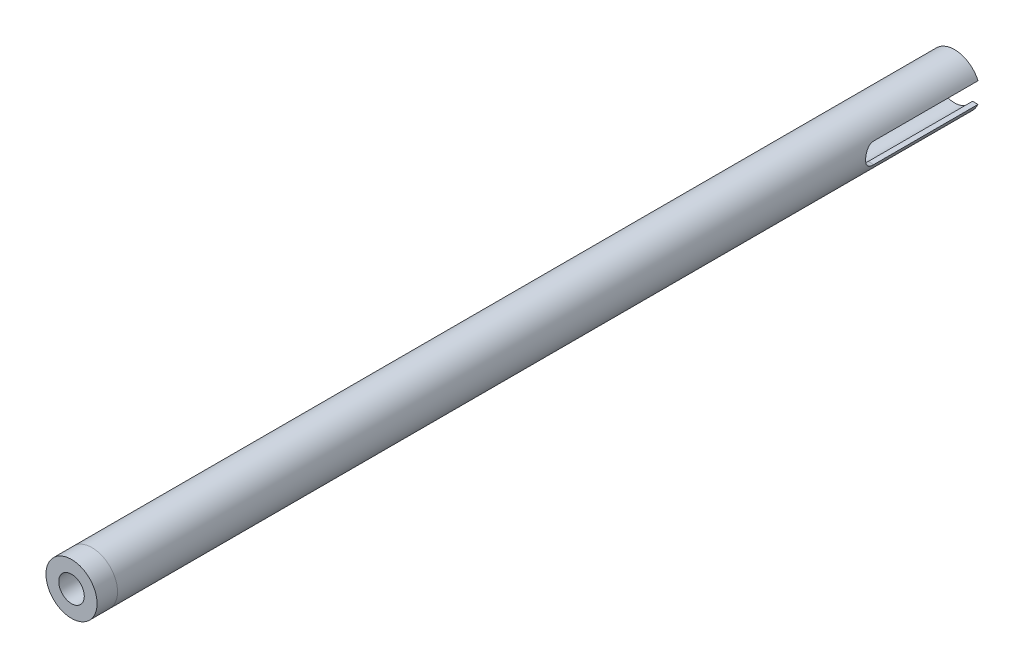
ISO-10303-21;
HEADER;
FILE_DESCRIPTION(('STEP AP214'),'2;1');
FILE_NAME('part.step','',(''),(''),'','','');
FILE_SCHEMA(('AUTOMOTIVE_DESIGN { 1 0 10303 214 1 1 1 1 }'));
ENDSEC;
DATA;
#1=APPLICATION_CONTEXT('core data for automotive mechanical design processes');
#2=APPLICATION_PROTOCOL_DEFINITION('international standard','automotive_design',2000,#1);
#3=PRODUCT_CONTEXT('',#1,'mechanical');
#4=PRODUCT('Part','Part','',(#3));
#5=PRODUCT_RELATED_PRODUCT_CATEGORY('part','',(#4));
#6=PRODUCT_DEFINITION_FORMATION('','',#4);
#7=PRODUCT_DEFINITION_CONTEXT('part definition',#1,'design');
#8=PRODUCT_DEFINITION('design','',#6,#7);
#9=PRODUCT_DEFINITION_SHAPE('','',#8);
#10=(LENGTH_UNIT() NAMED_UNIT(*) SI_UNIT(.MILLI.,.METRE.));
#11=(NAMED_UNIT(*) PLANE_ANGLE_UNIT() SI_UNIT($,.RADIAN.));
#12=(NAMED_UNIT(*) SI_UNIT($,.STERADIAN.) SOLID_ANGLE_UNIT());
#13=UNCERTAINTY_MEASURE_WITH_UNIT(LENGTH_MEASURE(1.E-05),#10,'distance_accuracy_value','');
#14=(GEOMETRIC_REPRESENTATION_CONTEXT(3) GLOBAL_UNCERTAINTY_ASSIGNED_CONTEXT((#13)) GLOBAL_UNIT_ASSIGNED_CONTEXT((#10,
#11,#12)) REPRESENTATION_CONTEXT('',''));
#15=CARTESIAN_POINT('',(0.,0.,0.));
#16=DIRECTION('',(0.,0.,1.));
#17=DIRECTION('',(1.,0.,0.));
#18=AXIS2_PLACEMENT_3D('',#15,#16,#17);
#19=CARTESIAN_POINT('',(0.,0.,-274.208037482781));
#20=DIRECTION('',(0.,0.,1.));
#21=DIRECTION('',(1.,0.,0.));
#22=AXIS2_PLACEMENT_3D('',#19,#20,#21);
#23=CYLINDRICAL_SURFACE('',#22,7.9375);
#24=CARTESIAN_POINT('',(0.,0.,-6.35));
#25=DIRECTION('',(0.,0.,1.));
#26=DIRECTION('',(1.,0.,0.));
#27=AXIS2_PLACEMENT_3D('',#24,#25,#26);
#28=CIRCLE('',#27,7.9375);
#29=CARTESIAN_POINT('',(7.9375,0.,-6.35));
#30=VERTEX_POINT('',#29);
#31=EDGE_CURVE('E167',#30,#30,#28,.T.);
#32=ORIENTED_EDGE('',*,*,#31,.F.);
#33=EDGE_LOOP('',(#32));
#34=FACE_BOUND('',#33,.T.);
#35=CARTESIAN_POINT('',(-7.2748389157424,3.175,-241.823037482782));
#36=CARTESIAN_POINT('',(-7.27482137043434,3.17501267173453,-241.737617367299));
#37=CARTESIAN_POINT('',(-7.27634297592672,3.17155313247793,-241.652206837736));
#38=CARTESIAN_POINT('',(-7.28233338484875,3.15778866907725,-241.482074833408));
#39=CARTESIAN_POINT('',(-7.28680106535325,3.14748635311323,-241.397353108549));
#40=CARTESIAN_POINT('',(-7.29852916312671,3.12019002880163,-241.22953940874));
#41=CARTESIAN_POINT('',(-7.30577831906487,3.10322299732752,-241.146442263981));
#42=CARTESIAN_POINT('',(-7.32282161153745,3.06278779397034,-240.982131161956));
#43=CARTESIAN_POINT('',(-7.33261590324725,3.03931922568673,-240.900917319842));
#44=CARTESIAN_POINT('',(-7.36535331460444,2.9595292434296,-240.66109249726));
#45=CARTESIAN_POINT('',(-7.3916759567784,2.89376893609236,-240.505967568456));
#46=CARTESIAN_POINT('',(-7.45033259991548,2.73920602658921,-240.208880141745));
#47=CARTESIAN_POINT('',(-7.48267254395243,2.65038060922871,-240.066930866527));
#48=CARTESIAN_POINT('',(-7.55175295441386,2.44684429809695,-239.792210097007));
#49=CARTESIAN_POINT('',(-7.58863404630154,2.33103943595689,-239.660282712495));
#50=CARTESIAN_POINT('',(-7.66147718953598,2.07914562663536,-239.417119828863));
#51=CARTESIAN_POINT('',(-7.69743902899202,1.94305205135847,-239.305889063936));
#52=CARTESIAN_POINT('',(-7.76611692840652,1.64778282664419,-239.10296786444));
#53=CARTESIAN_POINT('',(-7.79864638434712,1.48790317306356,-239.012233453037));
#54=CARTESIAN_POINT('',(-7.85502980346525,1.15369615984564,-238.859375899619));
#55=CARTESIAN_POINT('',(-7.87889360585224,0.979385463602719,-238.797220287002));
#56=CARTESIAN_POINT('',(-7.91022225039827,0.670405323433344,-238.716708643346));
#57=CARTESIAN_POINT('',(-7.92038443902171,0.537888188660429,-238.691030719936));
#58=CARTESIAN_POINT('',(-7.93061686811603,0.337231082382099,-238.665275636855));
#59=CARTESIAN_POINT('',(-7.93319257341971,0.269991647180292,-238.658817539574));
#60=CARTESIAN_POINT('',(-7.93663621925193,0.135173873369592,-238.650196521823));
#61=CARTESIAN_POINT('',(-7.93750363389236,0.0675954368175841,-238.648034924004));
#62=CARTESIAN_POINT('',(-7.9375,0.,-238.648037482782));
#63=B_SPLINE_CURVE_WITH_KNOTS('',3,(#35,#36,#37,#38,#39,#40,#41,#42,#43,#44,#45,#46,#47,#48,#49,
#50,#51,#52,#53,#54,#55,#56,#57,#58,#59,#60,#61,#62),.UNSPECIFIED.,.F.,.F.,(4,2,2,2,2,2,2,2,2,2,
2,2,2,4),(0.,0.25616079739664,0.512224013007086,0.767261264672294,1.02231406945474,
1.53142416248601,2.041039780479,2.57679273649399,3.11266809162684,3.66991136029741,
4.22651992730647,4.63134321412667,4.83399375866621,5.03670667834029),.UNSPECIFIED.);
#64=CARTESIAN_POINT('',(-7.2748389157424,3.175,-241.823037482782));
#65=VERTEX_POINT('',#64);
#66=CARTESIAN_POINT('',(-7.9375,0.,-238.648037482782));
#67=VERTEX_POINT('',#66);
#68=EDGE_CURVE('E194',#65,#67,#63,.T.);
#69=ORIENTED_EDGE('',*,*,#68,.T.);
#70=CARTESIAN_POINT('',(-7.9375,0.,-238.648037482782));
#71=CARTESIAN_POINT('',(-7.93751279435796,-0.0856973243893161,-238.648025452612));
#72=CARTESIAN_POINT('',(-7.93611246860092,-0.171386675169289,-238.651506820085));
#73=CARTESIAN_POINT('',(-7.93058107051394,-0.342092796869087,-238.665362915419));
#74=CARTESIAN_POINT('',(-7.92645080745519,-0.427109759557717,-238.675735600402));
#75=CARTESIAN_POINT('',(-7.91557399086504,-0.595570690948318,-238.70323279447));
#76=CARTESIAN_POINT('',(-7.90883664469869,-0.679019123580009,-238.720333545743));
#77=CARTESIAN_POINT('',(-7.89293284658536,-0.844038966454647,-238.761100793216));
#78=CARTESIAN_POINT('',(-7.88376629739099,-0.925610301410308,-238.784767552273));
#79=CARTESIAN_POINT('',(-7.8529700783248,-1.16656173687589,-238.865275207971));
#80=CARTESIAN_POINT('',(-7.82802544143957,-1.32244720282991,-238.931667840848));
#81=CARTESIAN_POINT('',(-7.77174407779742,-1.6208190257289,-239.087713244841));
#82=CARTESIAN_POINT('',(-7.74040257287306,-1.76329524966532,-239.177383416905));
#83=CARTESIAN_POINT('',(-7.67287736621953,-2.03755465224645,-239.38183702442));
#84=CARTESIAN_POINT('',(-7.63654472176442,-2.16862853615059,-239.497523881151));
#85=CARTESIAN_POINT('',(-7.56380976030912,-2.41011022612819,-239.74881798286));
#86=CARTESIAN_POINT('',(-7.52740741976911,-2.52050895891189,-239.884433927343));
#87=CARTESIAN_POINT('',(-7.45683282624283,-2.72240939900244,-240.179132422209));
#88=CARTESIAN_POINT('',(-7.42283467350379,-2.81283701743192,-240.338996412125));
#89=CARTESIAN_POINT('',(-7.36333622196319,-2.9651189416839,-240.673122376921));
#90=CARTESIAN_POINT('',(-7.33782422493328,-3.02701262758154,-240.84736411468));
#91=CARTESIAN_POINT('',(-7.30424985403508,-3.10695047193343,-241.155667839331));
#92=CARTESIAN_POINT('',(-7.29331360019112,-3.13238569878911,-241.287526600217));
#93=CARTESIAN_POINT('',(-7.2822797767429,-3.15790858319002,-241.487243481911));
#94=CARTESIAN_POINT('',(-7.27949685702346,-3.16431127275807,-241.554191772671));
#95=CARTESIAN_POINT('',(-7.27577355567174,-3.17285909036155,-241.688433330537));
#96=CARTESIAN_POINT('',(-7.27483380475762,-3.17500276099679,-241.755726707835));
#97=CARTESIAN_POINT('',(-7.2748389157424,-3.175,-241.823037482782));
#98=B_SPLINE_CURVE_WITH_KNOTS('',3,(#70,#71,#72,#73,#74,#75,#76,#77,#78,#79,#80,#81,#82,#83,#84,
#85,#86,#87,#88,#89,#90,#91,#92,#93,#94,#95,#96,#97),.UNSPECIFIED.,.F.,.F.,(4,2,2,2,2,2,2,2,2,2,
2,2,2,4),(0.,0.256996432008006,0.513916713336977,0.769937797705395,1.02596913282158,
1.53722547809955,2.04886511530061,2.58219314099272,3.115754672018,3.67332953074265,
4.23013255190376,4.63306130520187,4.83485003827449,5.03670780985621),.UNSPECIFIED.);
#99=CARTESIAN_POINT('',(-7.2748389157424,-3.175,-241.823037482782));
#100=VERTEX_POINT('',#99);
#101=EDGE_CURVE('E146',#67,#100,#98,.T.);
#102=ORIENTED_EDGE('',*,*,#101,.T.);
#103=DIRECTION('',(0.,0.,-1.));
#104=VECTOR('',#103,1.);
#105=CARTESIAN_POINT('',(-7.2748389157424,-3.175,-238.648037482782));
#106=LINE('',#105,#104);
#107=CARTESIAN_POINT('',(-7.2748389157424,-3.175,-274.208037482781));
#108=VERTEX_POINT('',#107);
#109=EDGE_CURVE('E141',#100,#108,#106,.T.);
#110=ORIENTED_EDGE('',*,*,#109,.T.);
#111=CARTESIAN_POINT('',(0.,0.,-274.208037482781));
#112=DIRECTION('',(0.,0.,1.));
#113=DIRECTION('',(1.,0.,0.));
#114=AXIS2_PLACEMENT_3D('',#111,#112,#113);
#115=CIRCLE('',#114,7.9375);
#116=CARTESIAN_POINT('',(7.2748389157424,-3.175,-274.208037482781));
#117=VERTEX_POINT('',#116);
#118=EDGE_CURVE('E144',#108,#117,#115,.T.);
#119=ORIENTED_EDGE('',*,*,#118,.T.);
#120=DIRECTION('',(0.,0.,-1.));
#121=VECTOR('',#120,1.);
#122=CARTESIAN_POINT('',(7.2748389157424,-3.175,-238.648037482782));
#123=LINE('',#122,#121);
#124=CARTESIAN_POINT('',(7.2748389157424,-3.175,-241.823037482782));
#125=VERTEX_POINT('',#124);
#126=EDGE_CURVE('E427',#125,#117,#123,.T.);
#127=ORIENTED_EDGE('',*,*,#126,.F.);
#128=CARTESIAN_POINT('',(7.2748389157424,-3.175,-241.823037482782));
#129=CARTESIAN_POINT('',(7.27482137043434,-3.17501267173453,-241.737617367299));
#130=CARTESIAN_POINT('',(7.27634297592672,-3.17155313247793,-241.652206837736));
#131=CARTESIAN_POINT('',(7.28233338484875,-3.15778866907725,-241.482074833408));
#132=CARTESIAN_POINT('',(7.28680106535325,-3.14748635311323,-241.397353108549));
#133=CARTESIAN_POINT('',(7.29852916312671,-3.12019002880163,-241.22953940874));
#134=CARTESIAN_POINT('',(7.30577831906487,-3.10322299732752,-241.146442263981));
#135=CARTESIAN_POINT('',(7.32282161153745,-3.06278779397034,-240.982131161956));
#136=CARTESIAN_POINT('',(7.33261590324725,-3.03931922568673,-240.900917319842));
#137=CARTESIAN_POINT('',(7.36535331460444,-2.9595292434296,-240.66109249726));
#138=CARTESIAN_POINT('',(7.3916759567784,-2.89376893609236,-240.505967568456));
#139=CARTESIAN_POINT('',(7.45033259991548,-2.73920602658921,-240.208880141745));
#140=CARTESIAN_POINT('',(7.48267254395243,-2.65038060922871,-240.066930866527));
#141=CARTESIAN_POINT('',(7.55175295441386,-2.44684429809695,-239.792210097007));
#142=CARTESIAN_POINT('',(7.58863404630154,-2.33103943595689,-239.660282712495));
#143=CARTESIAN_POINT('',(7.66147718953598,-2.07914562663536,-239.417119828863));
#144=CARTESIAN_POINT('',(7.69743902899202,-1.94305205135847,-239.305889063936));
#145=CARTESIAN_POINT('',(7.76611692840652,-1.64778282664419,-239.10296786444));
#146=CARTESIAN_POINT('',(7.79864638434712,-1.48790317306356,-239.012233453037));
#147=CARTESIAN_POINT('',(7.85502980346525,-1.15369615984564,-238.859375899619));
#148=CARTESIAN_POINT('',(7.87889360585224,-0.979385463602719,-238.797220287002));
#149=CARTESIAN_POINT('',(7.91022225039827,-0.670405323433344,-238.716708643346));
#150=CARTESIAN_POINT('',(7.92038443902171,-0.537888188660429,-238.691030719936));
#151=CARTESIAN_POINT('',(7.93061686811603,-0.337231082382099,-238.665275636855));
#152=CARTESIAN_POINT('',(7.93319257341971,-0.269991647180292,-238.658817539574));
#153=CARTESIAN_POINT('',(7.93663621925193,-0.135173873369592,-238.650196521823));
#154=CARTESIAN_POINT('',(7.93750363389236,-0.0675954368175841,-238.648034924004));
#155=CARTESIAN_POINT('',(7.9375,0.,-238.648037482782));
#156=B_SPLINE_CURVE_WITH_KNOTS('',3,(#128,#129,#130,#131,#132,#133,#134,#135,#136,#137,#138,
#139,#140,#141,#142,#143,#144,#145,#146,#147,#148,#149,#150,#151,#152,#153,#154,#155),
.UNSPECIFIED.,.F.,.F.,(4,2,2,2,2,2,2,2,2,2,2,2,2,4),(0.,0.25616079739664,0.512224013007086,
0.767261264672294,1.02231406945474,1.53142416248601,2.041039780479,2.57679273649399,
3.11266809162684,3.66991136029741,4.22651992730647,4.63134321412667,4.83399375866621,
5.03670667834029),.UNSPECIFIED.);
#157=CARTESIAN_POINT('',(7.9375,0.,-238.648037482782));
#158=VERTEX_POINT('',#157);
#159=EDGE_CURVE('E87',#125,#158,#156,.T.);
#160=ORIENTED_EDGE('',*,*,#159,.T.);
#161=CARTESIAN_POINT('',(7.9375,0.,-238.648037482782));
#162=CARTESIAN_POINT('',(7.93751279435796,0.0856973243893161,-238.648025452612));
#163=CARTESIAN_POINT('',(7.93611246860092,0.171386675169289,-238.651506820085));
#164=CARTESIAN_POINT('',(7.93058107051394,0.342092796869087,-238.665362915419));
#165=CARTESIAN_POINT('',(7.92645080745519,0.427109759557717,-238.675735600402));
#166=CARTESIAN_POINT('',(7.91557399086504,0.595570690948318,-238.70323279447));
#167=CARTESIAN_POINT('',(7.90883664469869,0.679019123580009,-238.720333545743));
#168=CARTESIAN_POINT('',(7.89293284658536,0.844038966454647,-238.761100793216));
#169=CARTESIAN_POINT('',(7.88376629739099,0.925610301410308,-238.784767552273));
#170=CARTESIAN_POINT('',(7.8529700783248,1.16656173687589,-238.865275207971));
#171=CARTESIAN_POINT('',(7.82802544143957,1.32244720282991,-238.931667840848));
#172=CARTESIAN_POINT('',(7.77174407779742,1.6208190257289,-239.087713244841));
#173=CARTESIAN_POINT('',(7.74040257287306,1.76329524966532,-239.177383416905));
#174=CARTESIAN_POINT('',(7.67287736621953,2.03755465224645,-239.38183702442));
#175=CARTESIAN_POINT('',(7.63654472176442,2.16862853615059,-239.497523881151));
#176=CARTESIAN_POINT('',(7.56380976030912,2.41011022612819,-239.74881798286));
#177=CARTESIAN_POINT('',(7.52740741976911,2.52050895891189,-239.884433927343));
#178=CARTESIAN_POINT('',(7.45683282624283,2.72240939900244,-240.179132422209));
#179=CARTESIAN_POINT('',(7.42283467350379,2.81283701743192,-240.338996412125));
#180=CARTESIAN_POINT('',(7.36333622196319,2.9651189416839,-240.673122376921));
#181=CARTESIAN_POINT('',(7.33782422493328,3.02701262758154,-240.84736411468));
#182=CARTESIAN_POINT('',(7.30424985403508,3.10695047193343,-241.155667839331));
#183=CARTESIAN_POINT('',(7.29331360019112,3.13238569878911,-241.287526600217));
#184=CARTESIAN_POINT('',(7.2822797767429,3.15790858319002,-241.487243481911));
#185=CARTESIAN_POINT('',(7.27949685702346,3.16431127275807,-241.554191772671));
#186=CARTESIAN_POINT('',(7.27577355567174,3.17285909036155,-241.688433330537));
#187=CARTESIAN_POINT('',(7.27483380475762,3.17500276099679,-241.755726707835));
#188=CARTESIAN_POINT('',(7.2748389157424,3.175,-241.823037482782));
#189=B_SPLINE_CURVE_WITH_KNOTS('',3,(#161,#162,#163,#164,#165,#166,#167,#168,#169,#170,#171,
#172,#173,#174,#175,#176,#177,#178,#179,#180,#181,#182,#183,#184,#185,#186,#187,#188),
.UNSPECIFIED.,.F.,.F.,(4,2,2,2,2,2,2,2,2,2,2,2,2,4),(0.,0.256996432008006,0.513916713336977,
0.769937797705395,1.02596913282158,1.53722547809955,2.04886511530061,2.58219314099272,
3.115754672018,3.67332953074265,4.23013255190376,4.63306130520187,4.83485003827449,
5.03670780985621),.UNSPECIFIED.);
#190=CARTESIAN_POINT('',(7.2748389157424,3.175,-241.823037482782));
#191=VERTEX_POINT('',#190);
#192=EDGE_CURVE('E73',#158,#191,#189,.T.);
#193=ORIENTED_EDGE('',*,*,#192,.T.);
#194=DIRECTION('',(0.,0.,-1.));
#195=VECTOR('',#194,1.);
#196=CARTESIAN_POINT('',(7.2748389157424,3.175,-238.648037482782));
#197=LINE('',#196,#195);
#198=CARTESIAN_POINT('',(7.2748389157424,3.175,-274.208037482781));
#199=VERTEX_POINT('',#198);
#200=EDGE_CURVE('E160',#191,#199,#197,.T.);
#201=ORIENTED_EDGE('',*,*,#200,.T.);
#202=CARTESIAN_POINT('',(-7.2748389157424,3.175,-274.208037482781));
#203=VERTEX_POINT('',#202);
#204=EDGE_CURVE('E166',#199,#203,#115,.T.);
#205=ORIENTED_EDGE('',*,*,#204,.T.);
#206=DIRECTION('',(0.,0.,-1.));
#207=VECTOR('',#206,1.);
#208=CARTESIAN_POINT('',(-7.2748389157424,3.175,-238.648037482782));
#209=LINE('',#208,#207);
#210=EDGE_CURVE('E420',#65,#203,#209,.T.);
#211=ORIENTED_EDGE('',*,*,#210,.F.);
#212=EDGE_LOOP('',(#69,#102,#110,#119,#127,#160,#193,#201,#205,#211));
#213=FACE_BOUND('',#212,.T.);
#214=ADVANCED_FACE('F63',(#34,#213),#23,.T.);
#215=CARTESIAN_POINT('',(0.,0.,-274.208037482781));
#216=DIRECTION('',(0.,0.,1.));
#217=DIRECTION('',(1.,0.,0.));
#218=AXIS2_PLACEMENT_3D('',#215,#216,#217);
#219=PLANE('',#218);
#220=DIRECTION('',(1.,0.,0.));
#221=VECTOR('',#220,1.);
#222=CARTESIAN_POINT('',(0.,-3.175,-274.208037482781));
#223=LINE('',#222,#221);
#224=CARTESIAN_POINT('',(-5.57246419907746,-3.175,-274.208037482781));
#225=VERTEX_POINT('',#224);
#226=EDGE_CURVE('E153',#108,#225,#223,.T.);
#227=ORIENTED_EDGE('',*,*,#226,.T.);
#228=CARTESIAN_POINT('',(0.,0.,-274.208037482781));
#229=DIRECTION('',(0.,0.,1.));
#230=DIRECTION('',(1.,0.,0.));
#231=AXIS2_PLACEMENT_3D('',#228,#229,#230);
#232=CIRCLE('',#231,6.4135);
#233=CARTESIAN_POINT('',(5.57246419907746,-3.175,-274.208037482781));
#234=VERTEX_POINT('',#233);
#235=EDGE_CURVE('E275',#225,#234,#232,.T.);
#236=ORIENTED_EDGE('',*,*,#235,.T.);
#237=DIRECTION('',(1.,0.,0.));
#238=VECTOR('',#237,1.);
#239=CARTESIAN_POINT('',(0.,-3.175,-274.208037482781));
#240=LINE('',#239,#238);
#241=EDGE_CURVE('E165',#234,#117,#240,.T.);
#242=ORIENTED_EDGE('',*,*,#241,.T.);
#243=ORIENTED_EDGE('',*,*,#118,.F.);
#244=EDGE_LOOP('',(#227,#236,#242,#243));
#245=FACE_BOUND('',#244,.T.);
#246=ADVANCED_FACE('F163',(#245),#219,.F.);
#247=CARTESIAN_POINT('',(0.,0.,-274.208037482781));
#248=DIRECTION('',(0.,0.,1.));
#249=DIRECTION('',(1.,0.,0.));
#250=AXIS2_PLACEMENT_3D('',#247,#248,#249);
#251=CYLINDRICAL_SURFACE('',#250,6.4135);
#252=CARTESIAN_POINT('',(0.,0.,-6.35));
#253=DIRECTION('',(0.,0.,1.));
#254=DIRECTION('',(1.,0.,0.));
#255=AXIS2_PLACEMENT_3D('',#252,#253,#254);
#256=CIRCLE('',#255,6.4135);
#257=CARTESIAN_POINT('',(6.4135,0.,-6.35));
#258=VERTEX_POINT('',#257);
#259=EDGE_CURVE('E149',#258,#258,#256,.T.);
#260=ORIENTED_EDGE('',*,*,#259,.T.);
#261=EDGE_LOOP('',(#260));
#262=FACE_BOUND('',#261,.T.);
#263=DIRECTION('',(0.,0.,-1.));
#264=VECTOR('',#263,1.);
#265=CARTESIAN_POINT('',(-5.57246419907746,-3.175,-238.648037482782));
#266=LINE('',#265,#264);
#267=CARTESIAN_POINT('',(-5.57246419907746,-3.175,-241.823037482782));
#268=VERTEX_POINT('',#267);
#269=EDGE_CURVE('E150',#268,#225,#266,.T.);
#270=ORIENTED_EDGE('',*,*,#269,.F.);
#271=CARTESIAN_POINT('',(-5.57246419907746,-3.175,-241.823037482782));
#272=CARTESIAN_POINT('',(-5.57244013006406,-3.17501485930532,-241.739758369743));
#273=CARTESIAN_POINT('',(-5.57433046393328,-3.17172393593587,-241.656492602872));
#274=CARTESIAN_POINT('',(-5.58175879139227,-3.1586474174694,-241.490685018061));
#275=CARTESIAN_POINT('',(-5.58729459414878,-3.14886572313218,-241.408142795459));
#276=CARTESIAN_POINT('',(-5.60179156831921,-3.12299843383606,-241.24484598873));
#277=CARTESIAN_POINT('',(-5.61073298145,-3.10694918790095,-241.164083883817));
#278=CARTESIAN_POINT('',(-5.63171276239417,-3.068756659135,-241.004439968316));
#279=CARTESIAN_POINT('',(-5.64375147558632,-3.04661269666536,-240.925558368496));
#280=CARTESIAN_POINT('',(-5.6838799338154,-2.97148657354666,-240.692825193497));
#281=CARTESIAN_POINT('',(-5.71602843451585,-2.9097324304215,-240.542404696258));
#282=CARTESIAN_POINT('',(-5.78746445334563,-2.76491119647658,-240.25394747943));
#283=CARTESIAN_POINT('',(-5.82676307252431,-2.68181088046088,-240.115930522064));
#284=CARTESIAN_POINT('',(-5.91189137020973,-2.48887418737119,-239.844133438036));
#285=CARTESIAN_POINT('',(-5.95799203211626,-2.37743022169017,-239.711576635585));
#286=CARTESIAN_POINT('',(-6.04933625068999,-2.13433179626949,-239.466108966512));
#287=CARTESIAN_POINT('',(-6.09457954365872,-2.00267122837296,-239.353204059499));
#288=CARTESIAN_POINT('',(-6.18270630442022,-1.71220053093682,-239.142884767047));
#289=CARTESIAN_POINT('',(-6.22523407848511,-1.55216870534976,-239.046995016616));
#290=CARTESIAN_POINT('',(-6.29953728626817,-1.21586879246633,-238.884146120298));
#291=CARTESIAN_POINT('',(-6.33132906884324,-1.03962591706377,-238.817142942256));
#292=CARTESIAN_POINT('',(-6.37455801221378,-0.71941894247625,-238.727271109925));
#293=CARTESIAN_POINT('',(-6.38903678436651,-0.577736145507954,-238.69769839556));
#294=CARTESIAN_POINT('',(-6.40364692368403,-0.362616983152033,-238.667977321246));
#295=CARTESIAN_POINT('',(-6.40733246196224,-0.290370591494073,-238.660509808608));
#296=CARTESIAN_POINT('',(-6.41226237468065,-0.145424356491902,-238.650536919671));
#297=CARTESIAN_POINT('',(-6.41350576158006,-0.0727243416303689,-238.648033550733));
#298=CARTESIAN_POINT('',(-6.4135,0.,-238.648037482782));
#299=B_SPLINE_CURVE_WITH_KNOTS('',3,(#271,#272,#273,#274,#275,#276,#277,#278,#279,#280,#281,
#282,#283,#284,#285,#286,#287,#288,#289,#290,#291,#292,#293,#294,#295,#296,#297,#298),
.UNSPECIFIED.,.F.,.F.,(4,2,2,2,2,2,2,2,2,2,2,2,2,4),(0.,0.249729002226581,0.499308060527553,
0.74746066754666,0.995640957972498,1.49055300136661,1.98624009021396,2.52160227908799,
3.05712653941521,3.62817923327588,4.19835836008503,4.63305000595098,4.85103401853339,
5.06910615989469),.UNSPECIFIED.);
#300=CARTESIAN_POINT('',(-6.4135,0.,-238.648037482782));
#301=VERTEX_POINT('',#300);
#302=EDGE_CURVE('E221',#268,#301,#299,.T.);
#303=ORIENTED_EDGE('',*,*,#302,.T.);
#304=CARTESIAN_POINT('',(-6.4135,0.,-238.648037482782));
#305=CARTESIAN_POINT('',(-6.41351478956105,0.0839162873638157,-238.648024082885));
#306=CARTESIAN_POINT('',(-6.41185341043851,0.167823114288178,-238.651364008932));
#307=CARTESIAN_POINT('',(-6.40528923860734,0.334952536326366,-238.664646449537));
#308=CARTESIAN_POINT('',(-6.40038773102953,0.418175389480088,-238.674586346358));
#309=CARTESIAN_POINT('',(-6.38748331817869,0.582965498785218,-238.700905150876));
#310=CARTESIAN_POINT('',(-6.37949454331383,0.664538541389252,-238.717254726364));
#311=CARTESIAN_POINT('',(-6.36062930478242,0.825821595252369,-238.756193029958));
#312=CARTESIAN_POINT('',(-6.34975266552956,0.905531492908814,-238.778782137439));
#313=CARTESIAN_POINT('',(-6.31319792977548,1.14087800407252,-238.855518700198));
#314=CARTESIAN_POINT('',(-6.28356695572382,1.29306927815056,-238.918690348386));
#315=CARTESIAN_POINT('',(-6.216480326228,1.58455945770356,-239.066841090366));
#316=CARTESIAN_POINT('',(-6.17901685649498,1.72384528592311,-239.151841982146));
#317=CARTESIAN_POINT('',(-6.09713913910646,1.99475482128858,-239.346942120397));
#318=CARTESIAN_POINT('',(-6.05244508581476,2.12544046453043,-239.458226997136));
#319=CARTESIAN_POINT('',(-5.96206469267669,2.3671627718888,-239.700196443301));
#320=CARTESIAN_POINT('',(-5.9163776032387,2.47818397002904,-239.83089613514));
#321=CARTESIAN_POINT('',(-5.82517699615971,2.68591268931948,-240.119941964092));
#322=CARTESIAN_POINT('',(-5.77994318763785,2.78087960507694,-240.279637158673));
#323=CARTESIAN_POINT('',(-5.69959190124919,2.94207442790849,-240.615020435854));
#324=CARTESIAN_POINT('',(-5.66445328320705,3.00836254036258,-240.790674069026));
#325=CARTESIAN_POINT('',(-5.61637168534323,3.09697219420915,-241.109125443419));
#326=CARTESIAN_POINT('',(-5.60011055849822,3.1260622343607,-241.249540046079));
#327=CARTESIAN_POINT('',(-5.58363385282995,3.15533369889112,-241.462916924322));
#328=CARTESIAN_POINT('',(-5.57946041232981,3.16269716900745,-241.534648649203));
#329=CARTESIAN_POINT('',(-5.57386984218861,3.17253394278506,-241.678590589246));
#330=CARTESIAN_POINT('',(-5.57245416126573,3.17500467618403,-241.750801035917));
#331=CARTESIAN_POINT('',(-5.57246419907746,3.175,-241.823037482782));
#332=B_SPLINE_CURVE_WITH_KNOTS('',3,(#304,#305,#306,#307,#308,#309,#310,#311,#312,#313,#314,
#315,#316,#317,#318,#319,#320,#321,#322,#323,#324,#325,#326,#327,#328,#329,#330,#331),
.UNSPECIFIED.,.F.,.F.,(4,2,2,2,2,2,2,2,2,2,2,2,2,4),(0.,0.251650249697325,0.50320074729884,
0.753613280993143,1.00404104361823,1.50387930503277,2.00421864304454,2.53410176460238,
3.06439980342594,3.63519589642624,4.20478783377489,4.63602373673191,4.85251353275901,
5.06911702550462),.UNSPECIFIED.);
#333=CARTESIAN_POINT('',(-5.57246419907746,3.175,-241.823037482782));
#334=VERTEX_POINT('',#333);
#335=EDGE_CURVE('E186',#301,#334,#332,.T.);
#336=ORIENTED_EDGE('',*,*,#335,.T.);
#337=DIRECTION('',(0.,0.,-1.));
#338=VECTOR('',#337,1.);
#339=CARTESIAN_POINT('',(-5.57246419907746,3.175,-238.648037482782));
#340=LINE('',#339,#338);
#341=CARTESIAN_POINT('',(-5.57246419907746,3.175,-274.208037482781));
#342=VERTEX_POINT('',#341);
#343=EDGE_CURVE('E417',#334,#342,#340,.T.);
#344=ORIENTED_EDGE('',*,*,#343,.T.);
#345=CARTESIAN_POINT('',(5.57246419907746,3.175,-274.208037482781));
#346=VERTEX_POINT('',#345);
#347=EDGE_CURVE('E172',#346,#342,#232,.T.);
#348=ORIENTED_EDGE('',*,*,#347,.F.);
#349=DIRECTION('',(0.,0.,-1.));
#350=VECTOR('',#349,1.);
#351=CARTESIAN_POINT('',(5.57246419907746,3.175,-238.648037482782));
#352=LINE('',#351,#350);
#353=CARTESIAN_POINT('',(5.57246419907746,3.175,-241.823037482782));
#354=VERTEX_POINT('',#353);
#355=EDGE_CURVE('E269',#354,#346,#352,.T.);
#356=ORIENTED_EDGE('',*,*,#355,.F.);
#357=CARTESIAN_POINT('',(5.57246419907746,3.175,-241.823037482782));
#358=CARTESIAN_POINT('',(5.57244013006406,3.17501485930532,-241.739758369743));
#359=CARTESIAN_POINT('',(5.57433046393328,3.17172393593587,-241.656492602872));
#360=CARTESIAN_POINT('',(5.58175879139227,3.1586474174694,-241.490685018061));
#361=CARTESIAN_POINT('',(5.58729459414878,3.14886572313218,-241.408142795459));
#362=CARTESIAN_POINT('',(5.60179156831921,3.12299843383606,-241.24484598873));
#363=CARTESIAN_POINT('',(5.61073298145,3.10694918790095,-241.164083883817));
#364=CARTESIAN_POINT('',(5.63171276239417,3.068756659135,-241.004439968316));
#365=CARTESIAN_POINT('',(5.64375147558632,3.04661269666536,-240.925558368496));
#366=CARTESIAN_POINT('',(5.6838799338154,2.97148657354666,-240.692825193497));
#367=CARTESIAN_POINT('',(5.71602843451585,2.9097324304215,-240.542404696258));
#368=CARTESIAN_POINT('',(5.78746445334563,2.76491119647658,-240.25394747943));
#369=CARTESIAN_POINT('',(5.82676307252431,2.68181088046088,-240.115930522064));
#370=CARTESIAN_POINT('',(5.91189137020973,2.48887418737119,-239.844133438036));
#371=CARTESIAN_POINT('',(5.95799203211626,2.37743022169017,-239.711576635585));
#372=CARTESIAN_POINT('',(6.04933625068999,2.13433179626949,-239.466108966512));
#373=CARTESIAN_POINT('',(6.09457954365872,2.00267122837296,-239.353204059499));
#374=CARTESIAN_POINT('',(6.18270630442022,1.71220053093682,-239.142884767047));
#375=CARTESIAN_POINT('',(6.22523407848511,1.55216870534976,-239.046995016616));
#376=CARTESIAN_POINT('',(6.29953728626817,1.21586879246633,-238.884146120298));
#377=CARTESIAN_POINT('',(6.33132906884324,1.03962591706377,-238.817142942256));
#378=CARTESIAN_POINT('',(6.37455801221378,0.71941894247625,-238.727271109925));
#379=CARTESIAN_POINT('',(6.38903678436651,0.577736145507954,-238.69769839556));
#380=CARTESIAN_POINT('',(6.40364692368403,0.362616983152033,-238.667977321246));
#381=CARTESIAN_POINT('',(6.40733246196224,0.290370591494073,-238.660509808608));
#382=CARTESIAN_POINT('',(6.41226237468065,0.145424356491902,-238.650536919671));
#383=CARTESIAN_POINT('',(6.41350576158006,0.0727243416303689,-238.648033550733));
#384=CARTESIAN_POINT('',(6.4135,0.,-238.648037482782));
#385=B_SPLINE_CURVE_WITH_KNOTS('',3,(#357,#358,#359,#360,#361,#362,#363,#364,#365,#366,#367,
#368,#369,#370,#371,#372,#373,#374,#375,#376,#377,#378,#379,#380,#381,#382,#383,#384),
.UNSPECIFIED.,.F.,.F.,(4,2,2,2,2,2,2,2,2,2,2,2,2,4),(0.,0.249729002226581,0.499308060527553,
0.74746066754666,0.995640957972498,1.49055300136661,1.98624009021396,2.52160227908799,
3.05712653941521,3.62817923327588,4.19835836008503,4.63305000595098,4.85103401853339,
5.06910615989469),.UNSPECIFIED.);
#386=CARTESIAN_POINT('',(6.4135,0.,-238.648037482782));
#387=VERTEX_POINT('',#386);
#388=EDGE_CURVE('E13',#354,#387,#385,.T.);
#389=ORIENTED_EDGE('',*,*,#388,.T.);
#390=CARTESIAN_POINT('',(6.4135,0.,-238.648037482782));
#391=CARTESIAN_POINT('',(6.41351478956105,-0.0839162873638157,-238.648024082885));
#392=CARTESIAN_POINT('',(6.41185341043851,-0.167823114288178,-238.651364008932));
#393=CARTESIAN_POINT('',(6.40528923860734,-0.334952536326366,-238.664646449537));
#394=CARTESIAN_POINT('',(6.40038773102953,-0.418175389480088,-238.674586346358));
#395=CARTESIAN_POINT('',(6.38748331817869,-0.582965498785218,-238.700905150876));
#396=CARTESIAN_POINT('',(6.37949454331383,-0.664538541389252,-238.717254726364));
#397=CARTESIAN_POINT('',(6.36062930478242,-0.825821595252369,-238.756193029958));
#398=CARTESIAN_POINT('',(6.34975266552956,-0.905531492908814,-238.778782137439));
#399=CARTESIAN_POINT('',(6.31319792977548,-1.14087800407252,-238.855518700198));
#400=CARTESIAN_POINT('',(6.28356695572382,-1.29306927815056,-238.918690348386));
#401=CARTESIAN_POINT('',(6.216480326228,-1.58455945770356,-239.066841090366));
#402=CARTESIAN_POINT('',(6.17901685649498,-1.72384528592311,-239.151841982146));
#403=CARTESIAN_POINT('',(6.09713913910646,-1.99475482128858,-239.346942120397));
#404=CARTESIAN_POINT('',(6.05244508581476,-2.12544046453043,-239.458226997136));
#405=CARTESIAN_POINT('',(5.96206469267669,-2.3671627718888,-239.700196443301));
#406=CARTESIAN_POINT('',(5.9163776032387,-2.47818397002904,-239.83089613514));
#407=CARTESIAN_POINT('',(5.82517699615971,-2.68591268931948,-240.119941964092));
#408=CARTESIAN_POINT('',(5.77994318763785,-2.78087960507694,-240.279637158673));
#409=CARTESIAN_POINT('',(5.69959190124919,-2.94207442790849,-240.615020435854));
#410=CARTESIAN_POINT('',(5.66445328320705,-3.00836254036258,-240.790674069026));
#411=CARTESIAN_POINT('',(5.61637168534323,-3.09697219420915,-241.109125443419));
#412=CARTESIAN_POINT('',(5.60011055849822,-3.1260622343607,-241.249540046079));
#413=CARTESIAN_POINT('',(5.58363385282995,-3.15533369889112,-241.462916924322));
#414=CARTESIAN_POINT('',(5.57946041232981,-3.16269716900745,-241.534648649203));
#415=CARTESIAN_POINT('',(5.57386984218861,-3.17253394278506,-241.678590589246));
#416=CARTESIAN_POINT('',(5.57245416126573,-3.17500467618403,-241.750801035917));
#417=CARTESIAN_POINT('',(5.57246419907746,-3.175,-241.823037482782));
#418=B_SPLINE_CURVE_WITH_KNOTS('',3,(#390,#391,#392,#393,#394,#395,#396,#397,#398,#399,#400,
#401,#402,#403,#404,#405,#406,#407,#408,#409,#410,#411,#412,#413,#414,#415,#416,#417),
.UNSPECIFIED.,.F.,.F.,(4,2,2,2,2,2,2,2,2,2,2,2,2,4),(0.,0.251650249697325,0.50320074729884,
0.753613280993143,1.00404104361823,1.50387930503277,2.00421864304454,2.53410176460238,
3.06439980342594,3.63519589642624,4.20478783377489,4.63602373673191,4.85251353275901,
5.06911702550462),.UNSPECIFIED.);
#419=CARTESIAN_POINT('',(5.57246419907746,-3.175,-241.823037482782));
#420=VERTEX_POINT('',#419);
#421=EDGE_CURVE('E237',#387,#420,#418,.T.);
#422=ORIENTED_EDGE('',*,*,#421,.T.);
#423=DIRECTION('',(0.,0.,-1.));
#424=VECTOR('',#423,1.);
#425=CARTESIAN_POINT('',(5.57246419907746,-3.175,-238.648037482782));
#426=LINE('',#425,#424);
#427=EDGE_CURVE('E271',#420,#234,#426,.T.);
#428=ORIENTED_EDGE('',*,*,#427,.T.);
#429=ORIENTED_EDGE('',*,*,#235,.F.);
#430=EDGE_LOOP('',(#270,#303,#336,#344,#348,#356,#389,#422,#428,#429));
#431=FACE_BOUND('',#430,.T.);
#432=ADVANCED_FACE('F201',(#262,#431),#251,.F.);
#433=ORIENTED_EDGE('',*,*,#347,.T.);
#434=DIRECTION('',(1.,0.,0.));
#435=VECTOR('',#434,1.);
#436=CARTESIAN_POINT('',(0.,3.175,-274.208037482781));
#437=LINE('',#436,#435);
#438=EDGE_CURVE('E159',#203,#342,#437,.T.);
#439=ORIENTED_EDGE('',*,*,#438,.F.);
#440=ORIENTED_EDGE('',*,*,#204,.F.);
#441=DIRECTION('',(1.,0.,0.));
#442=VECTOR('',#441,1.);
#443=CARTESIAN_POINT('',(0.,3.175,-274.208037482781));
#444=LINE('',#443,#442);
#445=EDGE_CURVE('E253',#346,#199,#444,.T.);
#446=ORIENTED_EDGE('',*,*,#445,.F.);
#447=EDGE_LOOP('',(#433,#439,#440,#446));
#448=FACE_BOUND('',#447,.T.);
#449=ADVANCED_FACE('F286',(#448),#219,.F.);
#450=CARTESIAN_POINT('',(0.,0.,-6.35));
#451=DIRECTION('',(0.,0.,1.));
#452=DIRECTION('',(1.,0.,0.));
#453=AXIS2_PLACEMENT_3D('',#450,#451,#452);
#454=PLANE('',#453);
#455=ORIENTED_EDGE('',*,*,#259,.F.);
#456=EDGE_LOOP('',(#455));
#457=FACE_BOUND('',#456,.T.);
#458=ORIENTED_EDGE('',*,*,#31,.T.);
#459=EDGE_LOOP('',(#458));
#460=FACE_BOUND('',#459,.T.);
#461=ADVANCED_FACE('F283',(#457,#460),#454,.T.);
#462=CARTESIAN_POINT('',(0.,3.175,-238.648037482782));
#463=DIRECTION('',(0.,1.,0.));
#464=DIRECTION('',(0.,0.,1.));
#465=AXIS2_PLACEMENT_3D('',#462,#463,#464);
#466=PLANE('',#465);
#467=ORIENTED_EDGE('',*,*,#200,.F.);
#468=DIRECTION('',(1.,0.,0.));
#469=VECTOR('',#468,1.);
#470=CARTESIAN_POINT('',(5.57246419907746,3.175,-241.823037482782));
#471=LINE('',#470,#469);
#472=EDGE_CURVE('E184',#191,#354,#471,.F.);
#473=ORIENTED_EDGE('',*,*,#472,.T.);
#474=ORIENTED_EDGE('',*,*,#355,.T.);
#475=ORIENTED_EDGE('',*,*,#445,.T.);
#476=EDGE_LOOP('',(#467,#473,#474,#475));
#477=FACE_BOUND('',#476,.T.);
#478=ADVANCED_FACE('F266',(#477),#466,.F.);
#479=CARTESIAN_POINT('',(0.,-3.175,-238.648037482782));
#480=DIRECTION('',(0.,1.,0.));
#481=DIRECTION('',(0.,0.,1.));
#482=AXIS2_PLACEMENT_3D('',#479,#480,#481);
#483=PLANE('',#482);
#484=ORIENTED_EDGE('',*,*,#427,.F.);
#485=DIRECTION('',(1.,0.,0.));
#486=VECTOR('',#485,1.);
#487=CARTESIAN_POINT('',(0.,-3.175,-241.823037482782));
#488=LINE('',#487,#486);
#489=EDGE_CURVE('E181',#420,#125,#488,.T.);
#490=ORIENTED_EDGE('',*,*,#489,.T.);
#491=ORIENTED_EDGE('',*,*,#126,.T.);
#492=ORIENTED_EDGE('',*,*,#241,.F.);
#493=EDGE_LOOP('',(#484,#490,#491,#492));
#494=FACE_BOUND('',#493,.T.);
#495=ADVANCED_FACE('F361',(#494),#483,.T.);
#496=CARTESIAN_POINT('',(0.,-3.175,-238.648037482782));
#497=DIRECTION('',(0.,1.,0.));
#498=DIRECTION('',(0.,0.,1.));
#499=AXIS2_PLACEMENT_3D('',#496,#497,#498);
#500=PLANE('',#499);
#501=ORIENTED_EDGE('',*,*,#109,.F.);
#502=DIRECTION('',(1.,0.,0.));
#503=VECTOR('',#502,1.);
#504=CARTESIAN_POINT('',(0.,-3.175,-241.823037482782));
#505=LINE('',#504,#503);
#506=EDGE_CURVE('E179',#100,#268,#505,.T.);
#507=ORIENTED_EDGE('',*,*,#506,.T.);
#508=ORIENTED_EDGE('',*,*,#269,.T.);
#509=ORIENTED_EDGE('',*,*,#226,.F.);
#510=EDGE_LOOP('',(#501,#507,#508,#509));
#511=FACE_BOUND('',#510,.T.);
#512=ADVANCED_FACE('F154',(#511),#500,.T.);
#513=CARTESIAN_POINT('',(0.,3.175,-238.648037482782));
#514=DIRECTION('',(0.,1.,0.));
#515=DIRECTION('',(0.,0.,1.));
#516=AXIS2_PLACEMENT_3D('',#513,#514,#515);
#517=PLANE('',#516);
#518=ORIENTED_EDGE('',*,*,#343,.F.);
#519=DIRECTION('',(1.,0.,0.));
#520=VECTOR('',#519,1.);
#521=CARTESIAN_POINT('',(-7.2748389157424,3.175,-241.823037482782));
#522=LINE('',#521,#520);
#523=EDGE_CURVE('E170',#334,#65,#522,.F.);
#524=ORIENTED_EDGE('',*,*,#523,.T.);
#525=ORIENTED_EDGE('',*,*,#210,.T.);
#526=ORIENTED_EDGE('',*,*,#438,.T.);
#527=EDGE_LOOP('',(#518,#524,#525,#526));
#528=FACE_BOUND('',#527,.T.);
#529=ADVANCED_FACE('F216',(#528),#517,.F.);
#530=CARTESIAN_POINT('',(0.,0.,-241.823037482782));
#531=DIRECTION('',(1.,0.,0.));
#532=DIRECTION('',(0.,0.,-1.));
#533=AXIS2_PLACEMENT_3D('',#530,#531,#532);
#534=CYLINDRICAL_SURFACE('',#533,3.175);
#535=ORIENTED_EDGE('',*,*,#506,.F.);
#536=ORIENTED_EDGE('',*,*,#101,.F.);
#537=DIRECTION('',(1.,0.,0.));
#538=VECTOR('',#537,1.);
#539=CARTESIAN_POINT('',(0.,0.,-238.648037482782));
#540=LINE('',#539,#538);
#541=EDGE_CURVE('E251',#301,#67,#540,.F.);
#542=ORIENTED_EDGE('',*,*,#541,.F.);
#543=ORIENTED_EDGE('',*,*,#302,.F.);
#544=EDGE_LOOP('',(#535,#536,#542,#543));
#545=FACE_BOUND('',#544,.T.);
#546=ADVANCED_FACE('F209',(#545),#534,.F.);
#547=CARTESIAN_POINT('',(0.,0.,-241.823037482782));
#548=DIRECTION('',(-1.,0.,0.));
#549=DIRECTION('',(0.,0.,1.));
#550=AXIS2_PLACEMENT_3D('',#547,#548,#549);
#551=CYLINDRICAL_SURFACE('',#550,3.175);
#552=ORIENTED_EDGE('',*,*,#68,.F.);
#553=ORIENTED_EDGE('',*,*,#523,.F.);
#554=ORIENTED_EDGE('',*,*,#335,.F.);
#555=ORIENTED_EDGE('',*,*,#541,.T.);
#556=EDGE_LOOP('',(#552,#553,#554,#555));
#557=FACE_BOUND('',#556,.T.);
#558=ADVANCED_FACE('F205',(#557),#551,.F.);
#559=CARTESIAN_POINT('',(0.,0.,-241.823037482782));
#560=DIRECTION('',(-1.,0.,0.));
#561=DIRECTION('',(0.,0.,1.));
#562=AXIS2_PLACEMENT_3D('',#559,#560,#561);
#563=CYLINDRICAL_SURFACE('',#562,3.175);
#564=DIRECTION('',(1.,0.,0.));
#565=VECTOR('',#564,1.);
#566=CARTESIAN_POINT('',(7.2748389157424,0.,-238.648037482782));
#567=LINE('',#566,#565);
#568=EDGE_CURVE('E68',#387,#158,#567,.T.);
#569=ORIENTED_EDGE('',*,*,#568,.F.);
#570=ORIENTED_EDGE('',*,*,#388,.F.);
#571=ORIENTED_EDGE('',*,*,#472,.F.);
#572=ORIENTED_EDGE('',*,*,#192,.F.);
#573=EDGE_LOOP('',(#569,#570,#571,#572));
#574=FACE_BOUND('',#573,.T.);
#575=ADVANCED_FACE('F65',(#574),#563,.F.);
#576=CARTESIAN_POINT('',(0.,0.,-241.823037482782));
#577=DIRECTION('',(1.,0.,0.));
#578=DIRECTION('',(0.,0.,-1.));
#579=AXIS2_PLACEMENT_3D('',#576,#577,#578);
#580=CYLINDRICAL_SURFACE('',#579,3.175);
#581=ORIENTED_EDGE('',*,*,#421,.F.);
#582=ORIENTED_EDGE('',*,*,#568,.T.);
#583=ORIENTED_EDGE('',*,*,#159,.F.);
#584=ORIENTED_EDGE('',*,*,#489,.F.);
#585=EDGE_LOOP('',(#581,#582,#583,#584));
#586=FACE_BOUND('',#585,.T.);
#587=ADVANCED_FACE('F218',(#586),#580,.F.);
#588=CLOSED_SHELL('',(#214,#246,#432,#449,#461,#478,#495,#512,#529,#546,#558,#575,#587));
#589=MANIFOLD_SOLID_BREP('B2',#588);
#590=CARTESIAN_POINT('',(0.,0.,-6.35));
#591=DIRECTION('',(0.,0.,1.));
#592=DIRECTION('',(1.,0.,0.));
#593=AXIS2_PLACEMENT_3D('',#590,#591,#592);
#594=CYLINDRICAL_SURFACE('',#593,7.9375);
#595=CARTESIAN_POINT('',(0.,0.,-6.35));
#596=DIRECTION('',(0.,0.,1.));
#597=DIRECTION('',(1.,0.,0.));
#598=AXIS2_PLACEMENT_3D('',#595,#596,#597);
#599=CIRCLE('',#598,7.9375);
#600=CARTESIAN_POINT('',(7.9375,0.,-6.35));
#601=VERTEX_POINT('',#600);
#602=EDGE_CURVE('E62',#601,#601,#599,.T.);
#603=ORIENTED_EDGE('',*,*,#602,.T.);
#604=EDGE_LOOP('',(#603));
#605=FACE_BOUND('',#604,.T.);
#606=CARTESIAN_POINT('',(0.,0.,0.));
#607=DIRECTION('',(0.,0.,1.));
#608=DIRECTION('',(1.,0.,0.));
#609=AXIS2_PLACEMENT_3D('',#606,#607,#608);
#610=CIRCLE('',#609,7.9375);
#611=CARTESIAN_POINT('',(7.9375,0.,0.));
#612=VERTEX_POINT('',#611);
#613=EDGE_CURVE('E465',#612,#612,#610,.T.);
#614=ORIENTED_EDGE('',*,*,#613,.F.);
#615=EDGE_LOOP('',(#614));
#616=FACE_BOUND('',#615,.T.);
#617=ADVANCED_FACE('F454',(#605,#616),#594,.T.);
#618=CARTESIAN_POINT('',(0.,0.,-6.35));
#619=DIRECTION('',(0.,0.,1.));
#620=DIRECTION('',(1.,0.,0.));
#621=AXIS2_PLACEMENT_3D('',#618,#619,#620);
#622=CYLINDRICAL_SURFACE('',#621,3.96875);
#623=CARTESIAN_POINT('',(0.,0.,0.));
#624=DIRECTION('',(0.,0.,1.));
#625=DIRECTION('',(1.,0.,0.));
#626=AXIS2_PLACEMENT_3D('',#623,#624,#625);
#627=CIRCLE('',#626,3.96875);
#628=CARTESIAN_POINT('',(3.96875,0.,0.));
#629=VERTEX_POINT('',#628);
#630=EDGE_CURVE('E457',#629,#629,#627,.T.);
#631=ORIENTED_EDGE('',*,*,#630,.T.);
#632=EDGE_LOOP('',(#631));
#633=FACE_BOUND('',#632,.T.);
#634=CARTESIAN_POINT('',(0.,0.,-15.875));
#635=DIRECTION('',(0.,0.,1.));
#636=DIRECTION('',(1.,0.,0.));
#637=AXIS2_PLACEMENT_3D('',#634,#635,#636);
#638=CIRCLE('',#637,3.96875);
#639=CARTESIAN_POINT('',(3.96875,0.,-15.875));
#640=VERTEX_POINT('',#639);
#641=EDGE_CURVE('E477',#640,#640,#638,.T.);
#642=ORIENTED_EDGE('',*,*,#641,.F.);
#643=EDGE_LOOP('',(#642));
#644=FACE_BOUND('',#643,.T.);
#645=ADVANCED_FACE('F485',(#633,#644),#622,.F.);
#646=CARTESIAN_POINT('',(0.,0.,-6.35));
#647=DIRECTION('',(0.,0.,1.));
#648=DIRECTION('',(1.,0.,0.));
#649=AXIS2_PLACEMENT_3D('',#646,#647,#648);
#650=PLANE('',#649);
#651=CARTESIAN_POINT('',(0.,0.,-6.35));
#652=DIRECTION('',(0.,0.,1.));
#653=DIRECTION('',(1.,0.,0.));
#654=AXIS2_PLACEMENT_3D('',#651,#652,#653);
#655=CIRCLE('',#654,6.4135);
#656=CARTESIAN_POINT('',(6.4135,0.,-6.35));
#657=VERTEX_POINT('',#656);
#658=EDGE_CURVE('E467',#657,#657,#655,.T.);
#659=ORIENTED_EDGE('',*,*,#658,.T.);
#660=EDGE_LOOP('',(#659));
#661=FACE_BOUND('',#660,.T.);
#662=ORIENTED_EDGE('',*,*,#602,.F.);
#663=EDGE_LOOP('',(#662));
#664=FACE_BOUND('',#663,.T.);
#665=ADVANCED_FACE('F487',(#661,#664),#650,.F.);
#666=CARTESIAN_POINT('',(0.,0.,0.));
#667=DIRECTION('',(0.,0.,1.));
#668=DIRECTION('',(1.,0.,0.));
#669=AXIS2_PLACEMENT_3D('',#666,#667,#668);
#670=PLANE('',#669);
#671=ORIENTED_EDGE('',*,*,#613,.T.);
#672=EDGE_LOOP('',(#671));
#673=FACE_BOUND('',#672,.T.);
#674=ORIENTED_EDGE('',*,*,#630,.F.);
#675=EDGE_LOOP('',(#674));
#676=FACE_BOUND('',#675,.T.);
#677=ADVANCED_FACE('F493',(#673,#676),#670,.T.);
#678=CARTESIAN_POINT('',(0.,0.,-15.875));
#679=DIRECTION('',(0.,0.,1.));
#680=DIRECTION('',(1.,0.,0.));
#681=AXIS2_PLACEMENT_3D('',#678,#679,#680);
#682=CYLINDRICAL_SURFACE('',#681,6.4135);
#683=CARTESIAN_POINT('',(0.,0.,-15.875));
#684=DIRECTION('',(0.,0.,1.));
#685=DIRECTION('',(1.,0.,0.));
#686=AXIS2_PLACEMENT_3D('',#683,#684,#685);
#687=CIRCLE('',#686,6.4135);
#688=CARTESIAN_POINT('',(6.4135,0.,-15.875));
#689=VERTEX_POINT('',#688);
#690=EDGE_CURVE('E470',#689,#689,#687,.T.);
#691=CARTESIAN_POINT('',(6.4135,0.,-15.875));
#692=CARTESIAN_POINT('',(6.4135,0.,-15.77578125));
#693=CARTESIAN_POINT('',(6.4135,0.,-15.6765625));
#694=CARTESIAN_POINT('',(6.4135,0.,-15.478125));
#695=CARTESIAN_POINT('',(6.4135,0.,-15.37890625));
#696=CARTESIAN_POINT('',(6.4135,0.,-15.18046875));
#697=CARTESIAN_POINT('',(6.4135,0.,-15.08125));
#698=CARTESIAN_POINT('',(6.4135,0.,-14.8828125));
#699=CARTESIAN_POINT('',(6.4135,0.,-14.78359375));
#700=CARTESIAN_POINT('',(6.4135,0.,-14.58515625));
#701=CARTESIAN_POINT('',(6.4135,0.,-14.4859375));
#702=CARTESIAN_POINT('',(6.4135,0.,-14.2875));
#703=CARTESIAN_POINT('',(6.4135,0.,-14.18828125));
#704=CARTESIAN_POINT('',(6.4135,0.,-13.98984375));
#705=CARTESIAN_POINT('',(6.4135,0.,-13.890625));
#706=CARTESIAN_POINT('',(6.4135,0.,-13.6921875));
#707=CARTESIAN_POINT('',(6.4135,0.,-13.59296875));
#708=CARTESIAN_POINT('',(6.4135,0.,-13.39453125));
#709=CARTESIAN_POINT('',(6.4135,0.,-13.2953125));
#710=CARTESIAN_POINT('',(6.4135,0.,-13.096875));
#711=CARTESIAN_POINT('',(6.4135,0.,-12.99765625));
#712=CARTESIAN_POINT('',(6.4135,0.,-12.79921875));
#713=CARTESIAN_POINT('',(6.4135,0.,-12.7));
#714=CARTESIAN_POINT('',(6.4135,0.,-12.5015625));
#715=CARTESIAN_POINT('',(6.4135,0.,-12.40234375));
#716=CARTESIAN_POINT('',(6.4135,0.,-12.20390625));
#717=CARTESIAN_POINT('',(6.4135,0.,-12.1046875));
#718=CARTESIAN_POINT('',(6.4135,0.,-11.90625));
#719=CARTESIAN_POINT('',(6.4135,0.,-11.80703125));
#720=CARTESIAN_POINT('',(6.4135,0.,-11.60859375));
#721=CARTESIAN_POINT('',(6.4135,0.,-11.509375));
#722=CARTESIAN_POINT('',(6.4135,0.,-11.3109375));
#723=CARTESIAN_POINT('',(6.4135,0.,-11.21171875));
#724=CARTESIAN_POINT('',(6.4135,0.,-11.01328125));
#725=CARTESIAN_POINT('',(6.4135,0.,-10.9140625));
#726=CARTESIAN_POINT('',(6.4135,0.,-10.715625));
#727=CARTESIAN_POINT('',(6.4135,0.,-10.61640625));
#728=CARTESIAN_POINT('',(6.4135,0.,-10.41796875));
#729=CARTESIAN_POINT('',(6.4135,0.,-10.31875));
#730=CARTESIAN_POINT('',(6.4135,0.,-10.1203125));
#731=CARTESIAN_POINT('',(6.4135,0.,-10.02109375));
#732=CARTESIAN_POINT('',(6.4135,0.,-9.82265625));
#733=CARTESIAN_POINT('',(6.4135,0.,-9.7234375));
#734=CARTESIAN_POINT('',(6.4135,0.,-9.525));
#735=CARTESIAN_POINT('',(6.4135,0.,-9.42578125));
#736=CARTESIAN_POINT('',(6.4135,0.,-9.22734375));
#737=CARTESIAN_POINT('',(6.4135,0.,-9.128125));
#738=CARTESIAN_POINT('',(6.4135,0.,-8.9296875));
#739=CARTESIAN_POINT('',(6.4135,0.,-8.83046875));
#740=CARTESIAN_POINT('',(6.4135,0.,-8.63203125));
#741=CARTESIAN_POINT('',(6.4135,0.,-8.5328125));
#742=CARTESIAN_POINT('',(6.4135,0.,-8.334375));
#743=CARTESIAN_POINT('',(6.4135,0.,-8.23515625));
#744=CARTESIAN_POINT('',(6.4135,0.,-8.03671875));
#745=CARTESIAN_POINT('',(6.4135,0.,-7.9375));
#746=CARTESIAN_POINT('',(6.4135,0.,-7.7390625));
#747=CARTESIAN_POINT('',(6.4135,0.,-7.63984375));
#748=CARTESIAN_POINT('',(6.4135,0.,-7.44140625));
#749=CARTESIAN_POINT('',(6.4135,0.,-7.3421875));
#750=CARTESIAN_POINT('',(6.4135,0.,-7.14375));
#751=CARTESIAN_POINT('',(6.4135,0.,-7.04453125));
#752=CARTESIAN_POINT('',(6.4135,0.,-6.84609375));
#753=CARTESIAN_POINT('',(6.4135,0.,-6.746875));
#754=CARTESIAN_POINT('',(6.4135,0.,-6.5484375));
#755=CARTESIAN_POINT('',(6.4135,0.,-6.44921875));
#756=CARTESIAN_POINT('',(6.4135,0.,-6.35));
#757=B_SPLINE_CURVE_WITH_KNOTS('',3,(#691,#692,#693,#694,#695,#696,#697,#698,#699,#700,#701,
#702,#703,#704,#705,#706,#707,#708,#709,#710,#711,#712,#713,#714,#715,#716,#717,#718,#719,#720,
#721,#722,#723,#724,#725,#726,#727,#728,#729,#730,#731,#732,#733,#734,#735,#736,#737,#738,#739,
#740,#741,#742,#743,#744,#745,#746,#747,#748,#749,#750,#751,#752,#753,#754,#755,#756),
.UNSPECIFIED.,.F.,.F.,(4,2,2,2,2,2,2,2,2,2,2,2,2,2,2,2,2,2,2,2,2,2,2,2,2,2,2,2,2,2,2,2,4),(0.,
0.297656250000002,0.595312500000002,0.892968750000002,1.190625,1.48828125,1.7859375,2.08359375,
2.38125,2.67890625,2.9765625,3.27421875,3.571875,3.86953125,4.1671875,4.46484375,4.7625,
5.06015625,5.3578125,5.65546875,5.953125,6.25078125,6.5484375,6.84609375,7.14375,7.44140625,
7.7390625,8.03671875,8.334375,8.63203125,8.9296875,9.22734375,9.525),.UNSPECIFIED.);
#758=EDGE_CURVE('BSEAM498',#689,#657,#757,.T.);
#759=ORIENTED_EDGE('',*,*,#690,.T.);
#760=ORIENTED_EDGE('',*,*,#658,.F.);
#761=ORIENTED_EDGE('',*,*,#758,.T.);
#762=ORIENTED_EDGE('',*,*,#758,.F.);
#763=EDGE_LOOP('',(#759,#761,#760,#762));
#764=FACE_BOUND('',#763,.T.);
#765=ADVANCED_FACE('F498',(#764),#682,.T.);
#766=CARTESIAN_POINT('',(0.,0.,-15.875));
#767=DIRECTION('',(0.,0.,1.));
#768=DIRECTION('',(1.,0.,0.));
#769=AXIS2_PLACEMENT_3D('',#766,#767,#768);
#770=PLANE('',#769);
#771=ORIENTED_EDGE('',*,*,#641,.T.);
#772=EDGE_LOOP('',(#771));
#773=FACE_BOUND('',#772,.T.);
#774=ORIENTED_EDGE('',*,*,#690,.F.);
#775=EDGE_LOOP('',(#774));
#776=FACE_BOUND('',#775,.T.);
#777=ADVANCED_FACE('F482',(#773,#776),#770,.F.);
#778=CLOSED_SHELL('',(#617,#645,#665,#677,#765,#777));
#779=MANIFOLD_SOLID_BREP('B7',#778);
#780=ADVANCED_BREP_SHAPE_REPRESENTATION('',(#18,#589,#779),#14);
#781=SHAPE_DEFINITION_REPRESENTATION(#9,#780);
ENDSEC;
END-ISO-10303-21;
